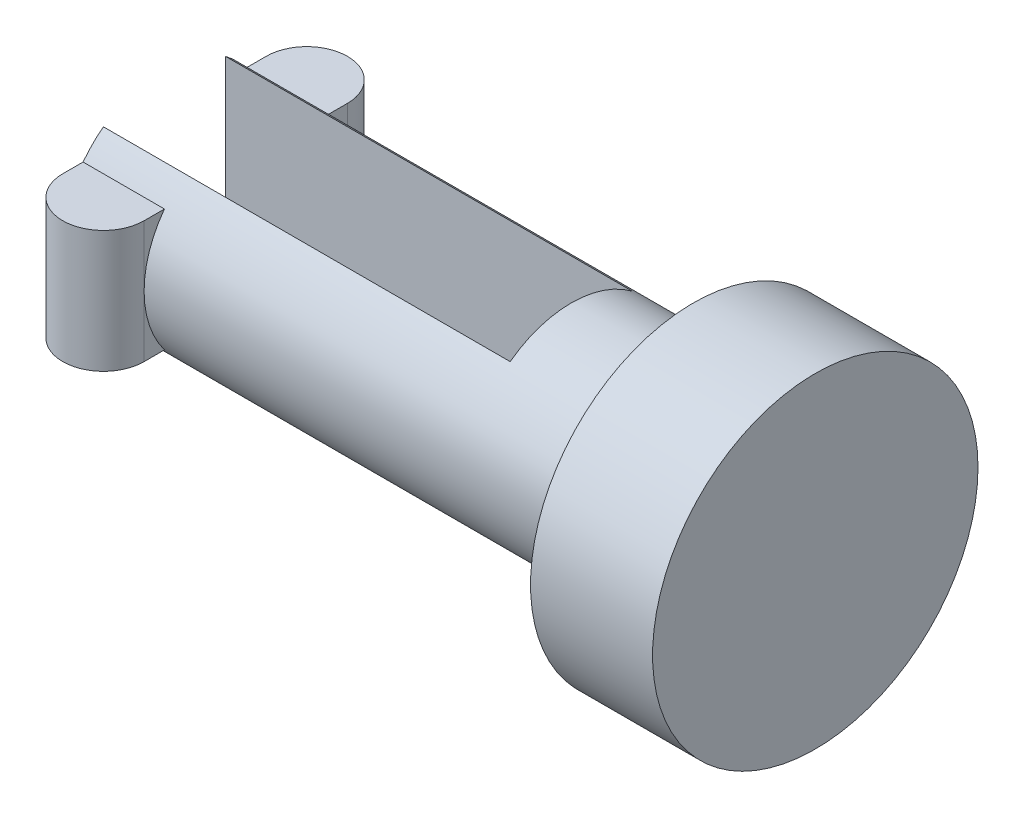
ISO-10303-21;
HEADER;
FILE_DESCRIPTION(('STEP AP214'),'2;1');
FILE_NAME('part.step','',(''),(''),'','','');
FILE_SCHEMA(('AUTOMOTIVE_DESIGN { 1 0 10303 214 1 1 1 1 }'));
ENDSEC;
DATA;
#1=APPLICATION_CONTEXT('core data for automotive mechanical design processes');
#2=APPLICATION_PROTOCOL_DEFINITION('international standard','automotive_design',2000,#1);
#3=PRODUCT_CONTEXT('',#1,'mechanical');
#4=PRODUCT('Part','Part','',(#3));
#5=PRODUCT_RELATED_PRODUCT_CATEGORY('part','',(#4));
#6=PRODUCT_DEFINITION_FORMATION('','',#4);
#7=PRODUCT_DEFINITION_CONTEXT('part definition',#1,'design');
#8=PRODUCT_DEFINITION('design','',#6,#7);
#9=PRODUCT_DEFINITION_SHAPE('','',#8);
#10=(LENGTH_UNIT() NAMED_UNIT(*) SI_UNIT(.MILLI.,.METRE.));
#11=(NAMED_UNIT(*) PLANE_ANGLE_UNIT() SI_UNIT($,.RADIAN.));
#12=(NAMED_UNIT(*) SI_UNIT($,.STERADIAN.) SOLID_ANGLE_UNIT());
#13=UNCERTAINTY_MEASURE_WITH_UNIT(LENGTH_MEASURE(1.E-05),#10,'distance_accuracy_value','');
#14=(GEOMETRIC_REPRESENTATION_CONTEXT(3) GLOBAL_UNCERTAINTY_ASSIGNED_CONTEXT((#13)) GLOBAL_UNIT_ASSIGNED_CONTEXT((#10,
#11,#12)) REPRESENTATION_CONTEXT('',''));
#15=CARTESIAN_POINT('',(0.,0.,0.));
#16=DIRECTION('',(0.,0.,1.));
#17=DIRECTION('',(1.,0.,0.));
#18=AXIS2_PLACEMENT_3D('',#15,#16,#17);
#19=CARTESIAN_POINT('',(-13.,0.,0.));
#20=DIRECTION('',(1.,0.,0.));
#21=DIRECTION('',(0.,0.,-1.));
#22=AXIS2_PLACEMENT_3D('',#19,#20,#21);
#23=PLANE('',#22);
#24=CARTESIAN_POINT('',(-13.,0.,0.));
#25=DIRECTION('',(1.,0.,0.));
#26=DIRECTION('',(0.,0.,-1.));
#27=AXIS2_PLACEMENT_3D('',#24,#25,#26);
#28=CIRCLE('',#27,2.5);
#29=CARTESIAN_POINT('',(-13.,-2.,-1.5));
#30=VERTEX_POINT('',#29);
#31=CARTESIAN_POINT('',(-13.,-1.5,-2.));
#32=VERTEX_POINT('',#31);
#33=EDGE_CURVE('E205',#30,#32,#28,.T.);
#34=ORIENTED_EDGE('',*,*,#33,.F.);
#35=DIRECTION('',(0.,1.,0.));
#36=VECTOR('',#35,1.);
#37=CARTESIAN_POINT('',(-13.,0.,-1.5));
#38=LINE('',#37,#36);
#39=CARTESIAN_POINT('',(-13.,2.,-1.5));
#40=VERTEX_POINT('',#39);
#41=EDGE_CURVE('E220',#30,#40,#38,.T.);
#42=ORIENTED_EDGE('',*,*,#41,.T.);
#43=CARTESIAN_POINT('',(-13.,1.5,-2.));
#44=VERTEX_POINT('',#43);
#45=EDGE_CURVE('E206',#44,#40,#28,.T.);
#46=ORIENTED_EDGE('',*,*,#45,.F.);
#47=DIRECTION('',(0.,0.,1.));
#48=VECTOR('',#47,1.);
#49=CARTESIAN_POINT('',(-13.,1.5,-2.5));
#50=LINE('',#49,#48);
#51=CARTESIAN_POINT('',(-13.,1.5,-2.5));
#52=VERTEX_POINT('',#51);
#53=EDGE_CURVE('E164',#52,#44,#50,.T.);
#54=ORIENTED_EDGE('',*,*,#53,.F.);
#55=DIRECTION('',(0.,-1.,0.));
#56=VECTOR('',#55,1.);
#57=CARTESIAN_POINT('',(-13.,1.5,-2.5));
#58=LINE('',#57,#56);
#59=CARTESIAN_POINT('',(-13.,-1.5,-2.5));
#60=VERTEX_POINT('',#59);
#61=EDGE_CURVE('E186',#52,#60,#58,.T.);
#62=ORIENTED_EDGE('',*,*,#61,.T.);
#63=DIRECTION('',(0.,0.,1.));
#64=VECTOR('',#63,1.);
#65=CARTESIAN_POINT('',(-13.,-1.5,-2.5));
#66=LINE('',#65,#64);
#67=EDGE_CURVE('E175',#60,#32,#66,.T.);
#68=ORIENTED_EDGE('',*,*,#67,.T.);
#69=EDGE_LOOP('',(#34,#42,#46,#54,#62,#68));
#70=FACE_BOUND('',#69,.T.);
#71=ADVANCED_FACE('F33',(#70),#23,.F.);
#72=CARTESIAN_POINT('',(3.,0.,0.));
#73=DIRECTION('',(-1.,0.,0.));
#74=DIRECTION('',(0.,0.,1.));
#75=AXIS2_PLACEMENT_3D('',#72,#73,#74);
#76=CYLINDRICAL_SURFACE('',#75,4.);
#77=CARTESIAN_POINT('',(3.,0.,0.));
#78=DIRECTION('',(1.,0.,0.));
#79=DIRECTION('',(0.,0.,-1.));
#80=AXIS2_PLACEMENT_3D('',#77,#78,#79);
#81=CIRCLE('',#80,4.);
#82=CARTESIAN_POINT('',(3.,0.,-4.));
#83=VERTEX_POINT('',#82);
#84=EDGE_CURVE('E209',#83,#83,#81,.T.);
#85=ORIENTED_EDGE('',*,*,#84,.F.);
#86=EDGE_LOOP('',(#85));
#87=FACE_BOUND('',#86,.T.);
#88=CARTESIAN_POINT('',(0.,0.,0.));
#89=DIRECTION('',(1.,0.,0.));
#90=DIRECTION('',(0.,0.,-1.));
#91=AXIS2_PLACEMENT_3D('',#88,#89,#90);
#92=CIRCLE('',#91,4.);
#93=CARTESIAN_POINT('',(0.,0.,-4.));
#94=VERTEX_POINT('',#93);
#95=EDGE_CURVE('E213',#94,#94,#92,.T.);
#96=ORIENTED_EDGE('',*,*,#95,.T.);
#97=EDGE_LOOP('',(#96));
#98=FACE_BOUND('',#97,.T.);
#99=ADVANCED_FACE('F35',(#87,#98),#76,.T.);
#100=CARTESIAN_POINT('',(3.,0.,0.));
#101=DIRECTION('',(1.,0.,0.));
#102=DIRECTION('',(0.,0.,-1.));
#103=AXIS2_PLACEMENT_3D('',#100,#101,#102);
#104=PLANE('',#103);
#105=ORIENTED_EDGE('',*,*,#84,.T.);
#106=EDGE_LOOP('',(#105));
#107=FACE_BOUND('',#106,.T.);
#108=ADVANCED_FACE('F287',(#107),#104,.T.);
#109=CARTESIAN_POINT('',(0.,0.,0.));
#110=DIRECTION('',(1.,0.,0.));
#111=DIRECTION('',(0.,0.,-1.));
#112=AXIS2_PLACEMENT_3D('',#109,#110,#111);
#113=PLANE('',#112);
#114=CARTESIAN_POINT('',(0.,0.,0.));
#115=DIRECTION('',(1.,0.,0.));
#116=DIRECTION('',(0.,0.,-1.));
#117=AXIS2_PLACEMENT_3D('',#114,#115,#116);
#118=CIRCLE('',#117,2.5);
#119=CARTESIAN_POINT('',(0.,0.,-2.5));
#120=VERTEX_POINT('',#119);
#121=EDGE_CURVE('E202',#120,#120,#118,.T.);
#122=ORIENTED_EDGE('',*,*,#121,.T.);
#123=EDGE_LOOP('',(#122));
#124=FACE_BOUND('',#123,.T.);
#125=ORIENTED_EDGE('',*,*,#95,.F.);
#126=EDGE_LOOP('',(#125));
#127=FACE_BOUND('',#126,.T.);
#128=ADVANCED_FACE('F280',(#124,#127),#113,.F.);
#129=CARTESIAN_POINT('',(-13.,0.,0.));
#130=DIRECTION('',(1.,0.,0.));
#131=DIRECTION('',(0.,0.,-1.));
#132=AXIS2_PLACEMENT_3D('',#129,#130,#131);
#133=CYLINDRICAL_SURFACE('',#132,2.5);
#134=DIRECTION('',(1.,0.,0.));
#135=VECTOR('',#134,1.);
#136=CARTESIAN_POINT('',(-13.,-2.,-1.5));
#137=LINE('',#136,#135);
#138=CARTESIAN_POINT('',(-3.,-2.,-1.5));
#139=VERTEX_POINT('',#138);
#140=EDGE_CURVE('E148',#30,#139,#137,.T.);
#141=ORIENTED_EDGE('',*,*,#140,.F.);
#142=ORIENTED_EDGE('',*,*,#33,.T.);
#143=DIRECTION('',(1.,0.,0.));
#144=VECTOR('',#143,1.);
#145=CARTESIAN_POINT('',(-13.,-1.5,-2.));
#146=LINE('',#145,#144);
#147=CARTESIAN_POINT('',(-11.,-1.5,-2.));
#148=VERTEX_POINT('',#147);
#149=EDGE_CURVE('E184',#32,#148,#146,.T.);
#150=ORIENTED_EDGE('',*,*,#149,.T.);
#151=CARTESIAN_POINT('',(-11.,0.,0.));
#152=DIRECTION('',(1.,0.,0.));
#153=DIRECTION('',(0.,0.,-1.));
#154=AXIS2_PLACEMENT_3D('',#151,#152,#153);
#155=CIRCLE('',#154,2.5);
#156=CARTESIAN_POINT('',(-11.,0.,-2.5));
#157=VERTEX_POINT('',#156);
#158=EDGE_CURVE('E212',#157,#148,#155,.F.);
#159=ORIENTED_EDGE('',*,*,#158,.F.);
#160=CARTESIAN_POINT('',(-11.,1.5,-2.));
#161=VERTEX_POINT('',#160);
#162=EDGE_CURVE('E217',#161,#157,#155,.F.);
#163=ORIENTED_EDGE('',*,*,#162,.F.);
#164=DIRECTION('',(1.,0.,0.));
#165=VECTOR('',#164,1.);
#166=CARTESIAN_POINT('',(-13.,1.5,-2.));
#167=LINE('',#166,#165);
#168=EDGE_CURVE('E197',#44,#161,#167,.T.);
#169=ORIENTED_EDGE('',*,*,#168,.F.);
#170=ORIENTED_EDGE('',*,*,#45,.T.);
#171=DIRECTION('',(1.,0.,0.));
#172=VECTOR('',#171,1.);
#173=CARTESIAN_POINT('',(-13.,2.,-1.5));
#174=LINE('',#173,#172);
#175=CARTESIAN_POINT('',(-3.,2.,-1.5));
#176=VERTEX_POINT('',#175);
#177=EDGE_CURVE('E150',#176,#40,#174,.F.);
#178=ORIENTED_EDGE('',*,*,#177,.F.);
#179=CARTESIAN_POINT('',(-3.,0.,0.));
#180=DIRECTION('',(1.,0.,0.));
#181=DIRECTION('',(0.,0.,-1.));
#182=AXIS2_PLACEMENT_3D('',#179,#180,#181);
#183=CIRCLE('',#182,2.5);
#184=CARTESIAN_POINT('',(-3.,2.,1.5));
#185=VERTEX_POINT('',#184);
#186=EDGE_CURVE('E37',#185,#176,#183,.F.);
#187=ORIENTED_EDGE('',*,*,#186,.F.);
#188=DIRECTION('',(1.,0.,0.));
#189=VECTOR('',#188,1.);
#190=CARTESIAN_POINT('',(-13.,2.,1.5));
#191=LINE('',#190,#189);
#192=CARTESIAN_POINT('',(-13.,2.,1.5));
#193=VERTEX_POINT('',#192);
#194=EDGE_CURVE('E140',#193,#185,#191,.T.);
#195=ORIENTED_EDGE('',*,*,#194,.F.);
#196=CARTESIAN_POINT('',(-13.,1.5,2.));
#197=VERTEX_POINT('',#196);
#198=EDGE_CURVE('E204',#193,#197,#28,.T.);
#199=ORIENTED_EDGE('',*,*,#198,.T.);
#200=DIRECTION('',(1.,0.,0.));
#201=VECTOR('',#200,1.);
#202=CARTESIAN_POINT('',(-13.,1.5,2.));
#203=LINE('',#202,#201);
#204=CARTESIAN_POINT('',(-11.,1.5,2.));
#205=VERTEX_POINT('',#204);
#206=EDGE_CURVE('E199',#205,#197,#203,.F.);
#207=ORIENTED_EDGE('',*,*,#206,.F.);
#208=CARTESIAN_POINT('',(-11.,0.,2.5));
#209=VERTEX_POINT('',#208);
#210=EDGE_CURVE('E218',#209,#205,#155,.F.);
#211=ORIENTED_EDGE('',*,*,#210,.F.);
#212=CARTESIAN_POINT('',(-11.,-1.5,2.));
#213=VERTEX_POINT('',#212);
#214=EDGE_CURVE('E245',#213,#209,#155,.F.);
#215=ORIENTED_EDGE('',*,*,#214,.F.);
#216=DIRECTION('',(1.,0.,0.));
#217=VECTOR('',#216,1.);
#218=CARTESIAN_POINT('',(-13.,-1.5,2.));
#219=LINE('',#218,#217);
#220=CARTESIAN_POINT('',(-13.,-1.5,2.));
#221=VERTEX_POINT('',#220);
#222=EDGE_CURVE('E195',#213,#221,#219,.F.);
#223=ORIENTED_EDGE('',*,*,#222,.T.);
#224=CARTESIAN_POINT('',(-13.,-2.,1.5));
#225=VERTEX_POINT('',#224);
#226=EDGE_CURVE('E147',#221,#225,#28,.T.);
#227=ORIENTED_EDGE('',*,*,#226,.T.);
#228=DIRECTION('',(1.,0.,0.));
#229=VECTOR('',#228,1.);
#230=CARTESIAN_POINT('',(-13.,-2.,1.5));
#231=LINE('',#230,#229);
#232=CARTESIAN_POINT('',(-3.,-2.,1.5));
#233=VERTEX_POINT('',#232);
#234=EDGE_CURVE('E48',#233,#225,#231,.F.);
#235=ORIENTED_EDGE('',*,*,#234,.F.);
#236=EDGE_CURVE('E11',#139,#233,#183,.F.);
#237=ORIENTED_EDGE('',*,*,#236,.F.);
#238=EDGE_LOOP('',(#141,#142,#150,#159,#163,#169,#170,#178,#187,#195,#199,#207,#211,#215,#223,
#227,#235,#237));
#239=FACE_BOUND('',#238,.T.);
#240=ORIENTED_EDGE('',*,*,#121,.F.);
#241=EDGE_LOOP('',(#240));
#242=FACE_BOUND('',#241,.T.);
#243=ADVANCED_FACE('F143',(#239,#242),#133,.T.);
#244=ORIENTED_EDGE('',*,*,#198,.F.);
#245=DIRECTION('',(0.,-1.,0.));
#246=VECTOR('',#245,1.);
#247=CARTESIAN_POINT('',(-13.,0.,1.5));
#248=LINE('',#247,#246);
#249=EDGE_CURVE('E219',#193,#225,#248,.T.);
#250=ORIENTED_EDGE('',*,*,#249,.T.);
#251=ORIENTED_EDGE('',*,*,#226,.F.);
#252=CARTESIAN_POINT('',(-13.,-1.5,2.5));
#253=VERTEX_POINT('',#252);
#254=EDGE_CURVE('E174',#221,#253,#66,.T.);
#255=ORIENTED_EDGE('',*,*,#254,.T.);
#256=DIRECTION('',(0.,-1.,0.));
#257=VECTOR('',#256,1.);
#258=CARTESIAN_POINT('',(-13.,1.5,2.5));
#259=LINE('',#258,#257);
#260=CARTESIAN_POINT('',(-13.,1.5,2.5));
#261=VERTEX_POINT('',#260);
#262=EDGE_CURVE('E188',#261,#253,#259,.T.);
#263=ORIENTED_EDGE('',*,*,#262,.F.);
#264=EDGE_CURVE('E163',#197,#261,#50,.T.);
#265=ORIENTED_EDGE('',*,*,#264,.F.);
#266=EDGE_LOOP('',(#244,#250,#251,#255,#263,#265));
#267=FACE_BOUND('',#266,.T.);
#268=ADVANCED_FACE('F269',(#267),#23,.F.);
#269=CARTESIAN_POINT('',(-12.,1.5,2.5));
#270=DIRECTION('',(0.,1.,0.));
#271=DIRECTION('',(0.,0.,1.));
#272=AXIS2_PLACEMENT_3D('',#269,#270,#271);
#273=PLANE('',#272);
#274=ORIENTED_EDGE('',*,*,#53,.T.);
#275=ORIENTED_EDGE('',*,*,#168,.T.);
#276=DIRECTION('',(0.,0.,1.));
#277=VECTOR('',#276,1.);
#278=CARTESIAN_POINT('',(-11.,1.5,-2.5));
#279=LINE('',#278,#277);
#280=CARTESIAN_POINT('',(-11.,1.5,-2.5));
#281=VERTEX_POINT('',#280);
#282=EDGE_CURVE('E156',#281,#161,#279,.T.);
#283=ORIENTED_EDGE('',*,*,#282,.F.);
#284=CARTESIAN_POINT('',(-12.,1.5,-2.5));
#285=DIRECTION('',(0.,1.,0.));
#286=DIRECTION('',(0.,0.,1.));
#287=AXIS2_PLACEMENT_3D('',#284,#285,#286);
#288=CIRCLE('',#287,0.999999999999999);
#289=EDGE_CURVE('E166',#281,#52,#288,.T.);
#290=ORIENTED_EDGE('',*,*,#289,.T.);
#291=EDGE_LOOP('',(#274,#275,#283,#290));
#292=FACE_BOUND('',#291,.T.);
#293=ADVANCED_FACE('F271',(#292),#273,.T.);
#294=CARTESIAN_POINT('',(-11.,1.5,-2.5));
#295=DIRECTION('',(1.,0.,0.));
#296=DIRECTION('',(0.,0.,-1.));
#297=AXIS2_PLACEMENT_3D('',#294,#295,#296);
#298=PLANE('',#297);
#299=ORIENTED_EDGE('',*,*,#282,.T.);
#300=ORIENTED_EDGE('',*,*,#162,.T.);
#301=DIRECTION('',(0.,-1.,0.));
#302=VECTOR('',#301,1.);
#303=CARTESIAN_POINT('',(-11.,1.5,-2.5));
#304=LINE('',#303,#302);
#305=EDGE_CURVE('E181',#281,#157,#304,.T.);
#306=ORIENTED_EDGE('',*,*,#305,.F.);
#307=EDGE_LOOP('',(#299,#300,#306));
#308=FACE_BOUND('',#307,.T.);
#309=ADVANCED_FACE('F277',(#308),#298,.T.);
#310=CARTESIAN_POINT('',(-12.,1.5,-2.5));
#311=DIRECTION('',(0.,-1.,0.));
#312=DIRECTION('',(0.,0.,-1.));
#313=AXIS2_PLACEMENT_3D('',#310,#311,#312);
#314=CYLINDRICAL_SURFACE('',#313,0.999999999999999);
#315=CARTESIAN_POINT('',(-12.,-1.5,-2.5));
#316=DIRECTION('',(0.,1.,0.));
#317=DIRECTION('',(0.,0.,1.));
#318=AXIS2_PLACEMENT_3D('',#315,#316,#317);
#319=CIRCLE('',#318,0.999999999999999);
#320=CARTESIAN_POINT('',(-11.,-1.5,-2.5));
#321=VERTEX_POINT('',#320);
#322=EDGE_CURVE('E178',#321,#60,#319,.T.);
#323=ORIENTED_EDGE('',*,*,#322,.T.);
#324=ORIENTED_EDGE('',*,*,#61,.F.);
#325=ORIENTED_EDGE('',*,*,#289,.F.);
#326=ORIENTED_EDGE('',*,*,#305,.T.);
#327=EDGE_CURVE('E185',#157,#321,#304,.T.);
#328=ORIENTED_EDGE('',*,*,#327,.T.);
#329=EDGE_LOOP('',(#323,#324,#325,#326,#328));
#330=FACE_BOUND('',#329,.T.);
#331=ADVANCED_FACE('F240',(#330),#314,.T.);
#332=CARTESIAN_POINT('',(-12.,-1.5,2.5));
#333=DIRECTION('',(0.,1.,0.));
#334=DIRECTION('',(0.,0.,1.));
#335=AXIS2_PLACEMENT_3D('',#332,#333,#334);
#336=PLANE('',#335);
#337=ORIENTED_EDGE('',*,*,#149,.F.);
#338=ORIENTED_EDGE('',*,*,#67,.F.);
#339=ORIENTED_EDGE('',*,*,#322,.F.);
#340=DIRECTION('',(0.,0.,1.));
#341=VECTOR('',#340,1.);
#342=CARTESIAN_POINT('',(-11.,-1.5,-2.5));
#343=LINE('',#342,#341);
#344=EDGE_CURVE('E56',#321,#148,#343,.T.);
#345=ORIENTED_EDGE('',*,*,#344,.T.);
#346=EDGE_LOOP('',(#337,#338,#339,#345));
#347=FACE_BOUND('',#346,.T.);
#348=ADVANCED_FACE('F237',(#347),#336,.F.);
#349=ORIENTED_EDGE('',*,*,#327,.F.);
#350=ORIENTED_EDGE('',*,*,#158,.T.);
#351=ORIENTED_EDGE('',*,*,#344,.F.);
#352=EDGE_LOOP('',(#349,#350,#351));
#353=FACE_BOUND('',#352,.T.);
#354=ADVANCED_FACE('F243',(#353),#298,.T.);
#355=CARTESIAN_POINT('',(-11.,-1.5,2.5));
#356=VERTEX_POINT('',#355);
#357=EDGE_CURVE('E155',#213,#356,#343,.T.);
#358=ORIENTED_EDGE('',*,*,#357,.F.);
#359=ORIENTED_EDGE('',*,*,#214,.T.);
#360=DIRECTION('',(0.,-1.,0.));
#361=VECTOR('',#360,1.);
#362=CARTESIAN_POINT('',(-11.,1.5,2.5));
#363=LINE('',#362,#361);
#364=EDGE_CURVE('E169',#209,#356,#363,.T.);
#365=ORIENTED_EDGE('',*,*,#364,.T.);
#366=EDGE_LOOP('',(#358,#359,#365));
#367=FACE_BOUND('',#366,.T.);
#368=ADVANCED_FACE('F264',(#367),#298,.T.);
#369=CARTESIAN_POINT('',(-11.,1.5,2.5));
#370=VERTEX_POINT('',#369);
#371=EDGE_CURVE('E190',#370,#209,#363,.T.);
#372=ORIENTED_EDGE('',*,*,#371,.T.);
#373=ORIENTED_EDGE('',*,*,#210,.T.);
#374=EDGE_CURVE('E160',#205,#370,#279,.T.);
#375=ORIENTED_EDGE('',*,*,#374,.T.);
#376=EDGE_LOOP('',(#372,#373,#375));
#377=FACE_BOUND('',#376,.T.);
#378=ADVANCED_FACE('F253',(#377),#298,.T.);
#379=ORIENTED_EDGE('',*,*,#374,.F.);
#380=ORIENTED_EDGE('',*,*,#206,.T.);
#381=ORIENTED_EDGE('',*,*,#264,.T.);
#382=CARTESIAN_POINT('',(-12.,1.5,2.5));
#383=DIRECTION('',(0.,1.,0.));
#384=DIRECTION('',(0.,0.,1.));
#385=AXIS2_PLACEMENT_3D('',#382,#383,#384);
#386=CIRCLE('',#385,0.999999999999998);
#387=EDGE_CURVE('E159',#261,#370,#386,.T.);
#388=ORIENTED_EDGE('',*,*,#387,.T.);
#389=EDGE_LOOP('',(#379,#380,#381,#388));
#390=FACE_BOUND('',#389,.T.);
#391=ADVANCED_FACE('F256',(#390),#273,.T.);
#392=ORIENTED_EDGE('',*,*,#222,.F.);
#393=ORIENTED_EDGE('',*,*,#357,.T.);
#394=CARTESIAN_POINT('',(-12.,-1.5,2.5));
#395=DIRECTION('',(0.,1.,0.));
#396=DIRECTION('',(0.,0.,1.));
#397=AXIS2_PLACEMENT_3D('',#394,#395,#396);
#398=CIRCLE('',#397,0.999999999999998);
#399=EDGE_CURVE('E171',#253,#356,#398,.T.);
#400=ORIENTED_EDGE('',*,*,#399,.F.);
#401=ORIENTED_EDGE('',*,*,#254,.F.);
#402=EDGE_LOOP('',(#392,#393,#400,#401));
#403=FACE_BOUND('',#402,.T.);
#404=ADVANCED_FACE('F266',(#403),#336,.F.);
#405=CARTESIAN_POINT('',(-12.,1.5,2.5));
#406=DIRECTION('',(0.,-1.,0.));
#407=DIRECTION('',(0.,0.,-1.));
#408=AXIS2_PLACEMENT_3D('',#405,#406,#407);
#409=CYLINDRICAL_SURFACE('',#408,0.999999999999998);
#410=ORIENTED_EDGE('',*,*,#399,.T.);
#411=ORIENTED_EDGE('',*,*,#364,.F.);
#412=ORIENTED_EDGE('',*,*,#371,.F.);
#413=ORIENTED_EDGE('',*,*,#387,.F.);
#414=ORIENTED_EDGE('',*,*,#262,.T.);
#415=EDGE_LOOP('',(#410,#411,#412,#413,#414));
#416=FACE_BOUND('',#415,.T.);
#417=ADVANCED_FACE('F261',(#416),#409,.T.);
#418=CARTESIAN_POINT('',(-13.,-4.,-1.5));
#419=DIRECTION('',(0.,0.,-1.));
#420=DIRECTION('',(-1.,0.,0.));
#421=AXIS2_PLACEMENT_3D('',#418,#419,#420);
#422=PLANE('',#421);
#423=ORIENTED_EDGE('',*,*,#177,.T.);
#424=ORIENTED_EDGE('',*,*,#41,.F.);
#425=ORIENTED_EDGE('',*,*,#140,.T.);
#426=DIRECTION('',(0.,1.,0.));
#427=VECTOR('',#426,1.);
#428=CARTESIAN_POINT('',(-3.,-4.,-1.5));
#429=LINE('',#428,#427);
#430=EDGE_CURVE('E135',#139,#176,#429,.T.);
#431=ORIENTED_EDGE('',*,*,#430,.T.);
#432=EDGE_LOOP('',(#423,#424,#425,#431));
#433=FACE_BOUND('',#432,.T.);
#434=ADVANCED_FACE('F228',(#433),#422,.F.);
#435=CARTESIAN_POINT('',(-3.,-4.,-1.5));
#436=DIRECTION('',(1.,0.,0.));
#437=DIRECTION('',(0.,0.,-1.));
#438=AXIS2_PLACEMENT_3D('',#435,#436,#437);
#439=PLANE('',#438);
#440=ORIENTED_EDGE('',*,*,#236,.T.);
#441=DIRECTION('',(0.,1.,0.));
#442=VECTOR('',#441,1.);
#443=CARTESIAN_POINT('',(-3.,-4.,1.5));
#444=LINE('',#443,#442);
#445=EDGE_CURVE('E132',#233,#185,#444,.T.);
#446=ORIENTED_EDGE('',*,*,#445,.T.);
#447=ORIENTED_EDGE('',*,*,#186,.T.);
#448=ORIENTED_EDGE('',*,*,#430,.F.);
#449=EDGE_LOOP('',(#440,#446,#447,#448));
#450=FACE_BOUND('',#449,.T.);
#451=ADVANCED_FACE('F131',(#450),#439,.F.);
#452=CARTESIAN_POINT('',(-13.,-4.,1.5));
#453=DIRECTION('',(0.,0.,1.));
#454=DIRECTION('',(1.,0.,0.));
#455=AXIS2_PLACEMENT_3D('',#452,#453,#454);
#456=PLANE('',#455);
#457=ORIENTED_EDGE('',*,*,#234,.T.);
#458=ORIENTED_EDGE('',*,*,#249,.F.);
#459=ORIENTED_EDGE('',*,*,#194,.T.);
#460=ORIENTED_EDGE('',*,*,#445,.F.);
#461=EDGE_LOOP('',(#457,#458,#459,#460));
#462=FACE_BOUND('',#461,.T.);
#463=ADVANCED_FACE('F138',(#462),#456,.F.);
#464=CLOSED_SHELL('',(#71,#99,#108,#128,#243,#268,#293,#309,#331,#348,#354,#368,#378,#391,#404,
#417,#434,#451,#463));
#465=MANIFOLD_SOLID_BREP('B2',#464);
#466=ADVANCED_BREP_SHAPE_REPRESENTATION('',(#18,#465),#14);
#467=SHAPE_DEFINITION_REPRESENTATION(#9,#466);
ENDSEC;
END-ISO-10303-21;
